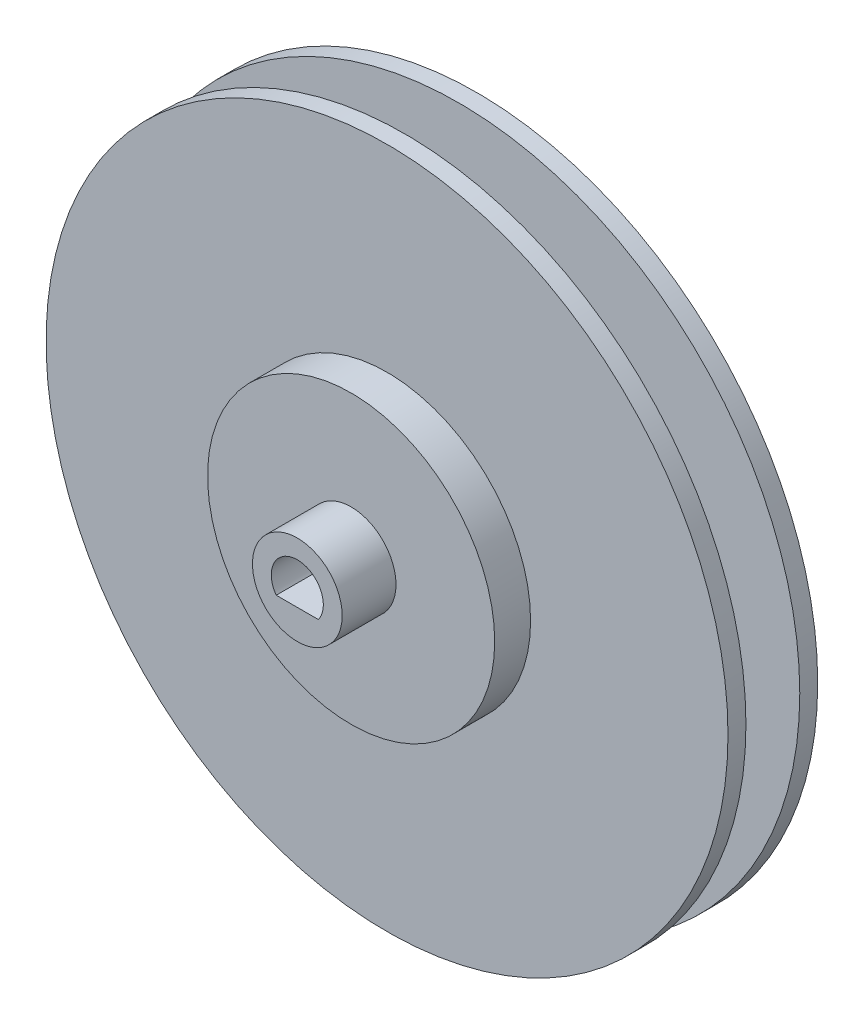
ISO-10303-21;
HEADER;
FILE_DESCRIPTION(('STEP AP214'),'2;1');
FILE_NAME('part.step','',(''),(''),'','','');
FILE_SCHEMA(('AUTOMOTIVE_DESIGN { 1 0 10303 214 1 1 1 1 }'));
ENDSEC;
DATA;
#1=APPLICATION_CONTEXT('core data for automotive mechanical design processes');
#2=APPLICATION_PROTOCOL_DEFINITION('international standard','automotive_design',2000,#1);
#3=PRODUCT_CONTEXT('',#1,'mechanical');
#4=PRODUCT('Part','Part','',(#3));
#5=PRODUCT_RELATED_PRODUCT_CATEGORY('part','',(#4));
#6=PRODUCT_DEFINITION_FORMATION('','',#4);
#7=PRODUCT_DEFINITION_CONTEXT('part definition',#1,'design');
#8=PRODUCT_DEFINITION('design','',#6,#7);
#9=PRODUCT_DEFINITION_SHAPE('','',#8);
#10=(LENGTH_UNIT() NAMED_UNIT(*) SI_UNIT(.MILLI.,.METRE.));
#11=(NAMED_UNIT(*) PLANE_ANGLE_UNIT() SI_UNIT($,.RADIAN.));
#12=(NAMED_UNIT(*) SI_UNIT($,.STERADIAN.) SOLID_ANGLE_UNIT());
#13=UNCERTAINTY_MEASURE_WITH_UNIT(LENGTH_MEASURE(1.E-05),#10,'distance_accuracy_value','');
#14=(GEOMETRIC_REPRESENTATION_CONTEXT(3) GLOBAL_UNCERTAINTY_ASSIGNED_CONTEXT((#13)) GLOBAL_UNIT_ASSIGNED_CONTEXT((#10,
#11,#12)) REPRESENTATION_CONTEXT('',''));
#15=CARTESIAN_POINT('',(0.,0.,0.));
#16=DIRECTION('',(0.,0.,1.));
#17=DIRECTION('',(1.,0.,0.));
#18=AXIS2_PLACEMENT_3D('',#15,#16,#17);
#19=CARTESIAN_POINT('',(0.,0.,2.5));
#20=DIRECTION('',(0.,0.,1.));
#21=DIRECTION('',(1.,0.,0.));
#22=AXIS2_PLACEMENT_3D('',#19,#20,#21);
#23=PLANE('',#22);
#24=CARTESIAN_POINT('',(0.,0.,2.5));
#25=DIRECTION('',(0.,0.,1.));
#26=DIRECTION('',(1.,0.,0.));
#27=AXIS2_PLACEMENT_3D('',#24,#25,#26);
#28=CIRCLE('',#27,6.);
#29=CARTESIAN_POINT('',(6.,0.,2.5));
#30=VERTEX_POINT('',#29);
#31=EDGE_CURVE('E115',#30,#30,#28,.F.);
#32=ORIENTED_EDGE('',*,*,#31,.T.);
#33=EDGE_LOOP('',(#32));
#34=FACE_BOUND('',#33,.T.);
#35=CARTESIAN_POINT('',(0.,0.,2.5));
#36=DIRECTION('',(0.,0.,1.));
#37=DIRECTION('',(1.,0.,0.));
#38=AXIS2_PLACEMENT_3D('',#35,#36,#37);
#39=CIRCLE('',#38,1.45);
#40=CARTESIAN_POINT('',(-1.17473401244707,-0.85,2.5));
#41=VERTEX_POINT('',#40);
#42=CARTESIAN_POINT('',(1.17473401244707,-0.85,2.5));
#43=VERTEX_POINT('',#42);
#44=EDGE_CURVE('E99',#41,#43,#39,.F.);
#45=ORIENTED_EDGE('',*,*,#44,.F.);
#46=DIRECTION('',(1.,0.,0.));
#47=VECTOR('',#46,1.);
#48=CARTESIAN_POINT('',(0.,-0.85,2.5));
#49=LINE('',#48,#47);
#50=EDGE_CURVE('E55',#41,#43,#49,.T.);
#51=ORIENTED_EDGE('',*,*,#50,.T.);
#52=EDGE_LOOP('',(#45,#51));
#53=FACE_BOUND('',#52,.T.);
#54=ADVANCED_FACE('F39',(#34,#53),#23,.F.);
#55=CARTESIAN_POINT('',(0.,0.,7.5));
#56=DIRECTION('',(0.,0.,1.));
#57=DIRECTION('',(1.,0.,0.));
#58=AXIS2_PLACEMENT_3D('',#55,#56,#57);
#59=PLANE('',#58);
#60=CARTESIAN_POINT('',(0.,0.,7.5));
#61=DIRECTION('',(0.,0.,1.));
#62=DIRECTION('',(1.,0.,0.));
#63=AXIS2_PLACEMENT_3D('',#60,#61,#62);
#64=CIRCLE('',#63,2.5);
#65=CARTESIAN_POINT('',(2.5,0.,7.5));
#66=VERTEX_POINT('',#65);
#67=EDGE_CURVE('E102',#66,#66,#64,.T.);
#68=ORIENTED_EDGE('',*,*,#67,.T.);
#69=EDGE_LOOP('',(#68));
#70=FACE_BOUND('',#69,.T.);
#71=CARTESIAN_POINT('',(0.,0.,7.5));
#72=DIRECTION('',(0.,0.,1.));
#73=DIRECTION('',(1.,0.,0.));
#74=AXIS2_PLACEMENT_3D('',#71,#72,#73);
#75=CIRCLE('',#74,1.45);
#76=CARTESIAN_POINT('',(1.17473401244707,-0.85,7.5));
#77=VERTEX_POINT('',#76);
#78=CARTESIAN_POINT('',(-1.17473401244707,-0.85,7.5));
#79=VERTEX_POINT('',#78);
#80=EDGE_CURVE('E96',#77,#79,#75,.T.);
#81=ORIENTED_EDGE('',*,*,#80,.F.);
#82=DIRECTION('',(-1.,0.,0.));
#83=VECTOR('',#82,1.);
#84=CARTESIAN_POINT('',(0.,-0.85,7.5));
#85=LINE('',#84,#83);
#86=EDGE_CURVE('E60',#77,#79,#85,.T.);
#87=ORIENTED_EDGE('',*,*,#86,.T.);
#88=EDGE_LOOP('',(#81,#87));
#89=FACE_BOUND('',#88,.T.);
#90=ADVANCED_FACE('F207',(#70,#89),#59,.T.);
#91=CARTESIAN_POINT('',(0.,0.,1.65));
#92=DIRECTION('',(0.,0.,1.));
#93=DIRECTION('',(1.,0.,0.));
#94=AXIS2_PLACEMENT_3D('',#91,#92,#93);
#95=CYLINDRICAL_SURFACE('',#94,7.);
#96=CARTESIAN_POINT('',(0.,0.,-1.5));
#97=DIRECTION('',(0.,0.,1.));
#98=DIRECTION('',(1.,0.,0.));
#99=AXIS2_PLACEMENT_3D('',#96,#97,#98);
#100=CIRCLE('',#99,7.);
#101=CARTESIAN_POINT('',(7.,0.,-1.5));
#102=VERTEX_POINT('',#101);
#103=EDGE_CURVE('E161',#102,#102,#100,.T.);
#104=ORIENTED_EDGE('',*,*,#103,.T.);
#105=EDGE_LOOP('',(#104));
#106=FACE_BOUND('',#105,.T.);
#107=CARTESIAN_POINT('',(0.,0.,1.5));
#108=DIRECTION('',(0.,0.,1.));
#109=DIRECTION('',(1.,0.,0.));
#110=AXIS2_PLACEMENT_3D('',#107,#108,#109);
#111=CIRCLE('',#110,7.);
#112=CARTESIAN_POINT('',(7.,0.,1.5));
#113=VERTEX_POINT('',#112);
#114=EDGE_CURVE('E158',#113,#113,#111,.T.);
#115=ORIENTED_EDGE('',*,*,#114,.F.);
#116=EDGE_LOOP('',(#115));
#117=FACE_BOUND('',#116,.T.);
#118=DIRECTION('',(0.,0.,1.));
#119=VECTOR('',#118,1.);
#120=CARTESIAN_POINT('',(-5.99039209145808,3.62149176315458,1.65));
#121=LINE('',#120,#119);
#122=CARTESIAN_POINT('',(-5.99039209145808,3.62149176315458,-1.2));
#123=VERTEX_POINT('',#122);
#124=CARTESIAN_POINT('',(-5.99039209145808,3.62149176315458,1.2));
#125=VERTEX_POINT('',#124);
#126=EDGE_CURVE('E138',#123,#125,#121,.T.);
#127=ORIENTED_EDGE('',*,*,#126,.F.);
#128=CARTESIAN_POINT('',(0.,0.,-1.2));
#129=DIRECTION('',(0.,0.,1.));
#130=DIRECTION('',(1.,0.,0.));
#131=AXIS2_PLACEMENT_3D('',#128,#129,#130);
#132=CIRCLE('',#131,7.);
#133=CARTESIAN_POINT('',(-4.89039209145808,5.00839946408074,-1.2));
#134=VERTEX_POINT('',#133);
#135=EDGE_CURVE('E142',#134,#123,#132,.T.);
#136=ORIENTED_EDGE('',*,*,#135,.F.);
#137=DIRECTION('',(0.,0.,1.));
#138=VECTOR('',#137,1.);
#139=CARTESIAN_POINT('',(-4.89039209145808,5.00839946408074,1.65));
#140=LINE('',#139,#138);
#141=CARTESIAN_POINT('',(-4.89039209145808,5.00839946408074,1.2));
#142=VERTEX_POINT('',#141);
#143=EDGE_CURVE('E130',#134,#142,#140,.T.);
#144=ORIENTED_EDGE('',*,*,#143,.T.);
#145=CARTESIAN_POINT('',(0.,0.,1.2));
#146=DIRECTION('',(0.,0.,-1.));
#147=DIRECTION('',(-1.,0.,0.));
#148=AXIS2_PLACEMENT_3D('',#145,#146,#147);
#149=CIRCLE('',#148,7.);
#150=EDGE_CURVE('E135',#125,#142,#149,.T.);
#151=ORIENTED_EDGE('',*,*,#150,.F.);
#152=EDGE_LOOP('',(#127,#136,#144,#151));
#153=FACE_BOUND('',#152,.T.);
#154=ADVANCED_FACE('F178',(#106,#117,#153),#95,.T.);
#155=CARTESIAN_POINT('',(0.,0.,1.65));
#156=DIRECTION('',(0.,0.,1.));
#157=DIRECTION('',(1.,0.,0.));
#158=AXIS2_PLACEMENT_3D('',#155,#156,#157);
#159=CYLINDRICAL_SURFACE('',#158,6.);
#160=ORIENTED_EDGE('',*,*,#31,.F.);
#161=EDGE_LOOP('',(#160));
#162=FACE_BOUND('',#161,.T.);
#163=CARTESIAN_POINT('',(0.,0.,-2.5));
#164=DIRECTION('',(0.,0.,1.));
#165=DIRECTION('',(1.,0.,0.));
#166=AXIS2_PLACEMENT_3D('',#163,#164,#165);
#167=CIRCLE('',#166,6.);
#168=CARTESIAN_POINT('',(6.,0.,-2.5));
#169=VERTEX_POINT('',#168);
#170=EDGE_CURVE('E43',#169,#169,#167,.T.);
#171=ORIENTED_EDGE('',*,*,#170,.F.);
#172=EDGE_LOOP('',(#171));
#173=FACE_BOUND('',#172,.T.);
#174=CARTESIAN_POINT('',(0.,0.,-1.2));
#175=DIRECTION('',(0.,0.,1.));
#176=DIRECTION('',(1.,0.,0.));
#177=AXIS2_PLACEMENT_3D('',#174,#175,#176);
#178=CIRCLE('',#177,6.);
#179=CARTESIAN_POINT('',(-4.89039209145808,3.47621420395871,-1.2));
#180=VERTEX_POINT('',#179);
#181=CARTESIAN_POINT('',(-5.99039209145808,0.339415071257179,-1.2));
#182=VERTEX_POINT('',#181);
#183=EDGE_CURVE('E124',#180,#182,#178,.T.);
#184=ORIENTED_EDGE('',*,*,#183,.T.);
#185=DIRECTION('',(0.,0.,1.));
#186=VECTOR('',#185,1.);
#187=CARTESIAN_POINT('',(-5.99039209145808,0.339415071257178,1.65));
#188=LINE('',#187,#186);
#189=CARTESIAN_POINT('',(-5.99039209145808,0.339415071257168,1.2));
#190=VERTEX_POINT('',#189);
#191=EDGE_CURVE('E123',#182,#190,#188,.T.);
#192=ORIENTED_EDGE('',*,*,#191,.T.);
#193=CARTESIAN_POINT('',(0.,0.,1.2));
#194=DIRECTION('',(0.,0.,-1.));
#195=DIRECTION('',(-1.,0.,0.));
#196=AXIS2_PLACEMENT_3D('',#193,#194,#195);
#197=CIRCLE('',#196,6.);
#198=CARTESIAN_POINT('',(-4.89039209145808,3.47621420395871,1.2));
#199=VERTEX_POINT('',#198);
#200=EDGE_CURVE('E120',#190,#199,#197,.T.);
#201=ORIENTED_EDGE('',*,*,#200,.T.);
#202=DIRECTION('',(0.,0.,1.));
#203=VECTOR('',#202,1.);
#204=CARTESIAN_POINT('',(-4.89039209145808,3.47621420395871,1.65));
#205=LINE('',#204,#203);
#206=EDGE_CURVE('E133',#180,#199,#205,.T.);
#207=ORIENTED_EDGE('',*,*,#206,.F.);
#208=EDGE_LOOP('',(#184,#192,#201,#207));
#209=FACE_BOUND('',#208,.T.);
#210=ADVANCED_FACE('F41',(#162,#173,#209),#159,.F.);
#211=CARTESIAN_POINT('',(0.,0.,2.5));
#212=DIRECTION('',(0.,0.,1.));
#213=DIRECTION('',(1.,0.,0.));
#214=AXIS2_PLACEMENT_3D('',#211,#212,#213);
#215=PLANE('',#214);
#216=CARTESIAN_POINT('',(0.,0.,2.5));
#217=DIRECTION('',(0.,0.,1.));
#218=DIRECTION('',(1.,0.,0.));
#219=AXIS2_PLACEMENT_3D('',#216,#217,#218);
#220=CIRCLE('',#219,8.);
#221=CARTESIAN_POINT('',(8.,0.,2.5));
#222=VERTEX_POINT('',#221);
#223=EDGE_CURVE('E110',#222,#222,#220,.T.);
#224=ORIENTED_EDGE('',*,*,#223,.F.);
#225=EDGE_LOOP('',(#224));
#226=FACE_BOUND('',#225,.T.);
#227=CARTESIAN_POINT('',(0.,0.,2.5));
#228=DIRECTION('',(0.,0.,1.));
#229=DIRECTION('',(1.,0.,0.));
#230=AXIS2_PLACEMENT_3D('',#227,#228,#229);
#231=CIRCLE('',#230,19.);
#232=CARTESIAN_POINT('',(19.,0.,2.5));
#233=VERTEX_POINT('',#232);
#234=EDGE_CURVE('E152',#233,#233,#231,.T.);
#235=ORIENTED_EDGE('',*,*,#234,.T.);
#236=EDGE_LOOP('',(#235));
#237=FACE_BOUND('',#236,.T.);
#238=ADVANCED_FACE('F177',(#226,#237),#215,.T.);
#239=CARTESIAN_POINT('',(0.,0.,1.65));
#240=DIRECTION('',(0.,0.,1.));
#241=DIRECTION('',(1.,0.,0.));
#242=AXIS2_PLACEMENT_3D('',#239,#240,#241);
#243=CYLINDRICAL_SURFACE('',#242,19.);
#244=ORIENTED_EDGE('',*,*,#234,.F.);
#245=EDGE_LOOP('',(#244));
#246=FACE_BOUND('',#245,.T.);
#247=CARTESIAN_POINT('',(0.,0.,1.5));
#248=DIRECTION('',(0.,0.,1.));
#249=DIRECTION('',(1.,0.,0.));
#250=AXIS2_PLACEMENT_3D('',#247,#248,#249);
#251=CIRCLE('',#250,19.);
#252=CARTESIAN_POINT('',(19.,0.,1.5));
#253=VERTEX_POINT('',#252);
#254=EDGE_CURVE('E155',#253,#253,#251,.T.);
#255=ORIENTED_EDGE('',*,*,#254,.T.);
#256=EDGE_LOOP('',(#255));
#257=FACE_BOUND('',#256,.T.);
#258=ADVANCED_FACE('F244',(#246,#257),#243,.T.);
#259=CARTESIAN_POINT('',(0.,0.,1.5));
#260=DIRECTION('',(0.,0.,1.));
#261=DIRECTION('',(1.,0.,0.));
#262=AXIS2_PLACEMENT_3D('',#259,#260,#261);
#263=PLANE('',#262);
#264=ORIENTED_EDGE('',*,*,#254,.F.);
#265=EDGE_LOOP('',(#264));
#266=FACE_BOUND('',#265,.T.);
#267=ORIENTED_EDGE('',*,*,#114,.T.);
#268=EDGE_LOOP('',(#267));
#269=FACE_BOUND('',#268,.T.);
#270=ADVANCED_FACE('F237',(#266,#269),#263,.F.);
#271=CARTESIAN_POINT('',(0.,0.,-1.5));
#272=DIRECTION('',(0.,0.,1.));
#273=DIRECTION('',(1.,0.,0.));
#274=AXIS2_PLACEMENT_3D('',#271,#272,#273);
#275=PLANE('',#274);
#276=CARTESIAN_POINT('',(0.,0.,-1.5));
#277=DIRECTION('',(0.,0.,1.));
#278=DIRECTION('',(1.,0.,0.));
#279=AXIS2_PLACEMENT_3D('',#276,#277,#278);
#280=CIRCLE('',#279,19.);
#281=CARTESIAN_POINT('',(19.,0.,-1.5));
#282=VERTEX_POINT('',#281);
#283=EDGE_CURVE('E164',#282,#282,#280,.T.);
#284=ORIENTED_EDGE('',*,*,#283,.T.);
#285=EDGE_LOOP('',(#284));
#286=FACE_BOUND('',#285,.T.);
#287=ORIENTED_EDGE('',*,*,#103,.F.);
#288=EDGE_LOOP('',(#287));
#289=FACE_BOUND('',#288,.T.);
#290=ADVANCED_FACE('F232',(#286,#289),#275,.T.);
#291=CARTESIAN_POINT('',(0.,0.,1.65));
#292=DIRECTION('',(0.,0.,1.));
#293=DIRECTION('',(1.,0.,0.));
#294=AXIS2_PLACEMENT_3D('',#291,#292,#293);
#295=CYLINDRICAL_SURFACE('',#294,19.);
#296=CARTESIAN_POINT('',(0.,0.,-2.5));
#297=DIRECTION('',(0.,0.,1.));
#298=DIRECTION('',(1.,0.,0.));
#299=AXIS2_PLACEMENT_3D('',#296,#297,#298);
#300=CIRCLE('',#299,19.);
#301=CARTESIAN_POINT('',(19.,0.,-2.5));
#302=VERTEX_POINT('',#301);
#303=EDGE_CURVE('E166',#302,#302,#300,.T.);
#304=ORIENTED_EDGE('',*,*,#303,.T.);
#305=EDGE_LOOP('',(#304));
#306=FACE_BOUND('',#305,.T.);
#307=ORIENTED_EDGE('',*,*,#283,.F.);
#308=EDGE_LOOP('',(#307));
#309=FACE_BOUND('',#308,.T.);
#310=ADVANCED_FACE('F227',(#306,#309),#295,.T.);
#311=CARTESIAN_POINT('',(0.,0.,-2.5));
#312=DIRECTION('',(0.,0.,1.));
#313=DIRECTION('',(1.,0.,0.));
#314=AXIS2_PLACEMENT_3D('',#311,#312,#313);
#315=PLANE('',#314);
#316=ORIENTED_EDGE('',*,*,#303,.F.);
#317=EDGE_LOOP('',(#316));
#318=FACE_BOUND('',#317,.T.);
#319=ORIENTED_EDGE('',*,*,#170,.T.);
#320=EDGE_LOOP('',(#319));
#321=FACE_BOUND('',#320,.T.);
#322=ADVANCED_FACE('F173',(#318,#321),#315,.F.);
#323=CARTESIAN_POINT('',(-5.99039209145808,3.62149176315458,-1.2));
#324=DIRECTION('',(0.,0.,1.));
#325=DIRECTION('',(1.,0.,0.));
#326=AXIS2_PLACEMENT_3D('',#323,#324,#325);
#327=PLANE('',#326);
#328=DIRECTION('',(0.,-1.,0.));
#329=VECTOR('',#328,1.);
#330=CARTESIAN_POINT('',(-4.89039209145808,5.00839946408074,-1.2));
#331=LINE('',#330,#329);
#332=EDGE_CURVE('E127',#134,#180,#331,.T.);
#333=ORIENTED_EDGE('',*,*,#332,.F.);
#334=ORIENTED_EDGE('',*,*,#135,.T.);
#335=DIRECTION('',(0.,-1.,0.));
#336=VECTOR('',#335,1.);
#337=CARTESIAN_POINT('',(-5.99039209145808,3.62149176315458,-1.2));
#338=LINE('',#337,#336);
#339=EDGE_CURVE('E141',#123,#182,#338,.T.);
#340=ORIENTED_EDGE('',*,*,#339,.T.);
#341=ORIENTED_EDGE('',*,*,#183,.F.);
#342=EDGE_LOOP('',(#333,#334,#340,#341));
#343=FACE_BOUND('',#342,.T.);
#344=ADVANCED_FACE('F183',(#343),#327,.T.);
#345=CARTESIAN_POINT('',(-5.99039209145808,3.62149176315458,1.65));
#346=DIRECTION('',(1.,0.,0.));
#347=DIRECTION('',(0.,0.,-1.));
#348=AXIS2_PLACEMENT_3D('',#345,#346,#347);
#349=PLANE('',#348);
#350=ORIENTED_EDGE('',*,*,#339,.F.);
#351=ORIENTED_EDGE('',*,*,#126,.T.);
#352=DIRECTION('',(0.,-1.,0.));
#353=VECTOR('',#352,1.);
#354=CARTESIAN_POINT('',(-5.99039209145808,3.62149176315458,1.2));
#355=LINE('',#354,#353);
#356=EDGE_CURVE('E137',#125,#190,#355,.T.);
#357=ORIENTED_EDGE('',*,*,#356,.T.);
#358=ORIENTED_EDGE('',*,*,#191,.F.);
#359=EDGE_LOOP('',(#350,#351,#357,#358));
#360=FACE_BOUND('',#359,.T.);
#361=ADVANCED_FACE('F193',(#360),#349,.T.);
#362=CARTESIAN_POINT('',(-4.89039209145808,5.00839946408074,1.2));
#363=DIRECTION('',(0.,0.,-1.));
#364=DIRECTION('',(-1.,0.,0.));
#365=AXIS2_PLACEMENT_3D('',#362,#363,#364);
#366=PLANE('',#365);
#367=ORIENTED_EDGE('',*,*,#356,.F.);
#368=ORIENTED_EDGE('',*,*,#150,.T.);
#369=DIRECTION('',(0.,-1.,0.));
#370=VECTOR('',#369,1.);
#371=CARTESIAN_POINT('',(-4.89039209145808,5.00839946408074,1.2));
#372=LINE('',#371,#370);
#373=EDGE_CURVE('E134',#142,#199,#372,.T.);
#374=ORIENTED_EDGE('',*,*,#373,.T.);
#375=ORIENTED_EDGE('',*,*,#200,.F.);
#376=EDGE_LOOP('',(#367,#368,#374,#375));
#377=FACE_BOUND('',#376,.T.);
#378=ADVANCED_FACE('F196',(#377),#366,.T.);
#379=CARTESIAN_POINT('',(-4.89039209145808,5.00839946408074,1.65));
#380=DIRECTION('',(1.,0.,0.));
#381=DIRECTION('',(0.,0.,-1.));
#382=AXIS2_PLACEMENT_3D('',#379,#380,#381);
#383=PLANE('',#382);
#384=ORIENTED_EDGE('',*,*,#206,.T.);
#385=ORIENTED_EDGE('',*,*,#373,.F.);
#386=ORIENTED_EDGE('',*,*,#143,.F.);
#387=ORIENTED_EDGE('',*,*,#332,.T.);
#388=EDGE_LOOP('',(#384,#385,#386,#387));
#389=FACE_BOUND('',#388,.T.);
#390=ADVANCED_FACE('F186',(#389),#383,.F.);
#391=CARTESIAN_POINT('',(0.,0.,4.5));
#392=DIRECTION('',(0.,0.,1.));
#393=DIRECTION('',(1.,0.,0.));
#394=AXIS2_PLACEMENT_3D('',#391,#392,#393);
#395=PLANE('',#394);
#396=CARTESIAN_POINT('',(0.,0.,4.5));
#397=DIRECTION('',(0.,0.,1.));
#398=DIRECTION('',(1.,0.,0.));
#399=AXIS2_PLACEMENT_3D('',#396,#397,#398);
#400=CIRCLE('',#399,2.5);
#401=CARTESIAN_POINT('',(2.5,0.,4.5));
#402=VERTEX_POINT('',#401);
#403=EDGE_CURVE('E11',#402,#402,#400,.T.);
#404=ORIENTED_EDGE('',*,*,#403,.F.);
#405=EDGE_LOOP('',(#404));
#406=FACE_BOUND('',#405,.T.);
#407=CARTESIAN_POINT('',(0.,0.,4.5));
#408=DIRECTION('',(0.,0.,1.));
#409=DIRECTION('',(1.,0.,0.));
#410=AXIS2_PLACEMENT_3D('',#407,#408,#409);
#411=CIRCLE('',#410,8.);
#412=CARTESIAN_POINT('',(8.,0.,4.5));
#413=VERTEX_POINT('',#412);
#414=EDGE_CURVE('E112',#413,#413,#411,.T.);
#415=ORIENTED_EDGE('',*,*,#414,.T.);
#416=EDGE_LOOP('',(#415));
#417=FACE_BOUND('',#416,.T.);
#418=ADVANCED_FACE('F203',(#406,#417),#395,.T.);
#419=CARTESIAN_POINT('',(0.,0.,4.5));
#420=DIRECTION('',(0.,0.,-1.));
#421=DIRECTION('',(-1.,0.,0.));
#422=AXIS2_PLACEMENT_3D('',#419,#420,#421);
#423=CYLINDRICAL_SURFACE('',#422,8.);
#424=ORIENTED_EDGE('',*,*,#414,.F.);
#425=EDGE_LOOP('',(#424));
#426=FACE_BOUND('',#425,.T.);
#427=ORIENTED_EDGE('',*,*,#223,.T.);
#428=EDGE_LOOP('',(#427));
#429=FACE_BOUND('',#428,.T.);
#430=ADVANCED_FACE('F218',(#426,#429),#423,.T.);
#431=CARTESIAN_POINT('',(0.,0.,7.5));
#432=DIRECTION('',(0.,0.,-1.));
#433=DIRECTION('',(-1.,0.,0.));
#434=AXIS2_PLACEMENT_3D('',#431,#432,#433);
#435=CYLINDRICAL_SURFACE('',#434,2.5);
#436=ORIENTED_EDGE('',*,*,#67,.F.);
#437=EDGE_LOOP('',(#436));
#438=FACE_BOUND('',#437,.T.);
#439=ORIENTED_EDGE('',*,*,#403,.T.);
#440=EDGE_LOOP('',(#439));
#441=FACE_BOUND('',#440,.T.);
#442=ADVANCED_FACE('F221',(#438,#441),#435,.T.);
#443=CARTESIAN_POINT('',(0.,-0.85,-2.501));
#444=DIRECTION('',(0.,1.,0.));
#445=DIRECTION('',(0.,0.,1.));
#446=AXIS2_PLACEMENT_3D('',#443,#444,#445);
#447=PLANE('',#446);
#448=DIRECTION('',(0.,0.,1.));
#449=VECTOR('',#448,1.);
#450=CARTESIAN_POINT('',(-1.17473401244707,-0.85,-2.501));
#451=LINE('',#450,#449);
#452=EDGE_CURVE('E95',#41,#79,#451,.T.);
#453=ORIENTED_EDGE('',*,*,#452,.T.);
#454=ORIENTED_EDGE('',*,*,#86,.F.);
#455=DIRECTION('',(0.,0.,1.));
#456=VECTOR('',#455,1.);
#457=CARTESIAN_POINT('',(1.17473401244707,-0.85,-2.501));
#458=LINE('',#457,#456);
#459=EDGE_CURVE('E89',#43,#77,#458,.T.);
#460=ORIENTED_EDGE('',*,*,#459,.F.);
#461=ORIENTED_EDGE('',*,*,#50,.F.);
#462=EDGE_LOOP('',(#453,#454,#460,#461));
#463=FACE_BOUND('',#462,.T.);
#464=ADVANCED_FACE('F91',(#463),#447,.T.);
#465=CARTESIAN_POINT('',(0.,0.,-2.501));
#466=DIRECTION('',(0.,0.,1.));
#467=DIRECTION('',(1.,0.,0.));
#468=AXIS2_PLACEMENT_3D('',#465,#466,#467);
#469=CYLINDRICAL_SURFACE('',#468,1.45);
#470=ORIENTED_EDGE('',*,*,#44,.T.);
#471=ORIENTED_EDGE('',*,*,#459,.T.);
#472=ORIENTED_EDGE('',*,*,#80,.T.);
#473=ORIENTED_EDGE('',*,*,#452,.F.);
#474=EDGE_LOOP('',(#470,#471,#472,#473));
#475=FACE_BOUND('',#474,.T.);
#476=ADVANCED_FACE('F100',(#475),#469,.F.);
#477=CLOSED_SHELL('',(#54,#90,#154,#210,#238,#258,#270,#290,#310,#322,#344,#361,#378,#390,#418,
#430,#442,#464,#476));
#478=MANIFOLD_SOLID_BREP('B2',#477);
#479=ADVANCED_BREP_SHAPE_REPRESENTATION('',(#18,#478),#14);
#480=SHAPE_DEFINITION_REPRESENTATION(#9,#479);
ENDSEC;
END-ISO-10303-21;
